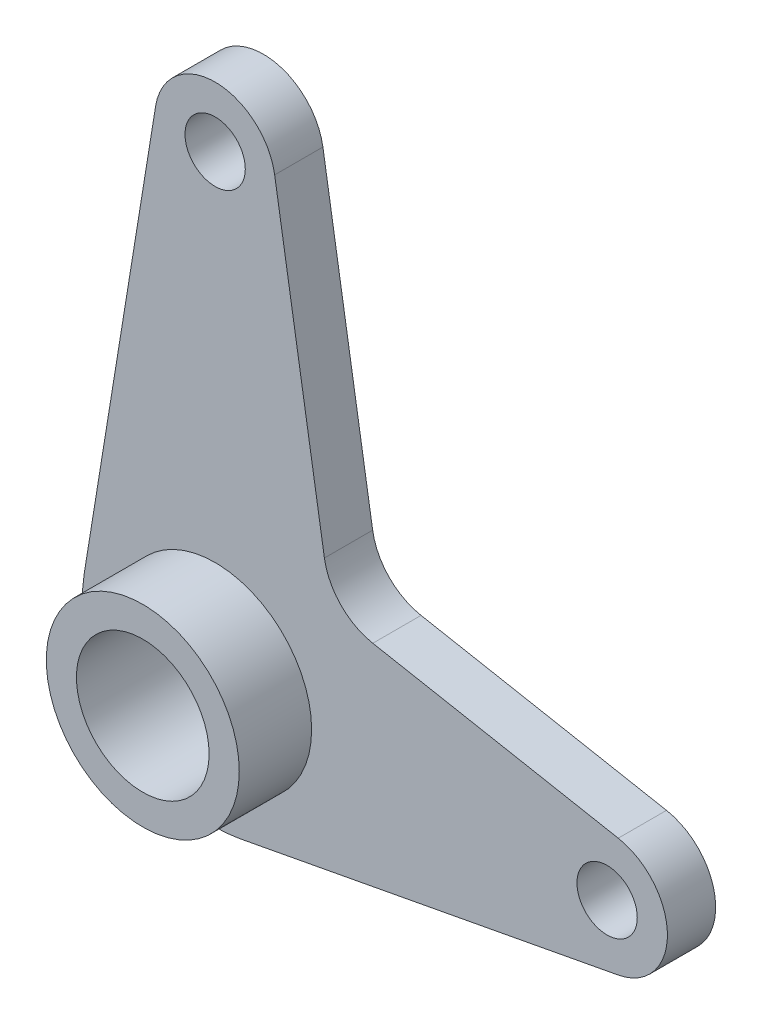
ISO-10303-21;
HEADER;
FILE_DESCRIPTION(('STEP AP214'),'2;1');
FILE_NAME('part.step','',(''),(''),'','','');
FILE_SCHEMA(('AUTOMOTIVE_DESIGN { 1 0 10303 214 1 1 1 1 }'));
ENDSEC;
DATA;
#1=APPLICATION_CONTEXT('core data for automotive mechanical design processes');
#2=APPLICATION_PROTOCOL_DEFINITION('international standard','automotive_design',2000,#1);
#3=PRODUCT_CONTEXT('',#1,'mechanical');
#4=PRODUCT('Part','Part','',(#3));
#5=PRODUCT_RELATED_PRODUCT_CATEGORY('part','',(#4));
#6=PRODUCT_DEFINITION_FORMATION('','',#4);
#7=PRODUCT_DEFINITION_CONTEXT('part definition',#1,'design');
#8=PRODUCT_DEFINITION('design','',#6,#7);
#9=PRODUCT_DEFINITION_SHAPE('','',#8);
#10=(LENGTH_UNIT() NAMED_UNIT(*) SI_UNIT(.MILLI.,.METRE.));
#11=(NAMED_UNIT(*) PLANE_ANGLE_UNIT() SI_UNIT($,.RADIAN.));
#12=(NAMED_UNIT(*) SI_UNIT($,.STERADIAN.) SOLID_ANGLE_UNIT());
#13=UNCERTAINTY_MEASURE_WITH_UNIT(LENGTH_MEASURE(1.E-05),#10,'distance_accuracy_value','');
#14=(GEOMETRIC_REPRESENTATION_CONTEXT(3) GLOBAL_UNCERTAINTY_ASSIGNED_CONTEXT((#13)) GLOBAL_UNIT_ASSIGNED_CONTEXT((#10,
#11,#12)) REPRESENTATION_CONTEXT('',''));
#15=CARTESIAN_POINT('',(0.,0.,0.));
#16=DIRECTION('',(0.,0.,1.));
#17=DIRECTION('',(1.,0.,0.));
#18=AXIS2_PLACEMENT_3D('',#15,#16,#17);
#19=CARTESIAN_POINT('',(27.9922328266238,27.3024419216633,8.));
#20=DIRECTION('',(0.,0.,1.));
#21=DIRECTION('',(1.,0.,0.));
#22=AXIS2_PLACEMENT_3D('',#19,#20,#21);
#23=PLANE('',#22);
#24=CARTESIAN_POINT('',(0.,0.,8.));
#25=DIRECTION('',(0.,0.,1.));
#26=DIRECTION('',(1.,0.,0.));
#27=AXIS2_PLACEMENT_3D('',#24,#25,#26);
#28=CIRCLE('',#27,16.);
#29=CARTESIAN_POINT('',(16.,0.,8.));
#30=VERTEX_POINT('',#29);
#31=EDGE_CURVE('E194',#30,#30,#28,.T.);
#32=ORIENTED_EDGE('',*,*,#31,.F.);
#33=EDGE_LOOP('',(#32));
#34=FACE_BOUND('',#33,.T.);
#35=CARTESIAN_POINT('',(0.,75.,8.));
#36=DIRECTION('',(0.,0.,1.));
#37=DIRECTION('',(1.,0.,0.));
#38=AXIS2_PLACEMENT_3D('',#35,#36,#37);
#39=CIRCLE('',#38,5.);
#40=CARTESIAN_POINT('',(5.,75.,8.));
#41=VERTEX_POINT('',#40);
#42=EDGE_CURVE('E137',#41,#41,#39,.T.);
#43=ORIENTED_EDGE('',*,*,#42,.F.);
#44=EDGE_LOOP('',(#43));
#45=FACE_BOUND('',#44,.T.);
#46=CARTESIAN_POINT('',(27.9922328266238,27.3024419216633,8.));
#47=DIRECTION('',(0.,0.,-1.));
#48=DIRECTION('',(1.,0.,0.));
#49=AXIS2_PLACEMENT_3D('',#46,#47,#48);
#50=CIRCLE('',#49,9.99999999999999);
#51=CARTESIAN_POINT('',(26.1458575860615,17.4743750481099,8.));
#52=VERTEX_POINT('',#51);
#53=CARTESIAN_POINT('',(18.1210626832213,25.7024419216633,8.));
#54=VERTEX_POINT('',#53);
#55=EDGE_CURVE('E148',#52,#54,#50,.T.);
#56=ORIENTED_EDGE('',*,*,#55,.T.);
#57=DIRECTION('',(-0.16,0.987117014340245,0.));
#58=VECTOR('',#57,1.);
#59=CARTESIAN_POINT('',(9.87117014340245,76.6,8.));
#60=LINE('',#59,#58);
#61=CARTESIAN_POINT('',(9.87117014340246,76.6,8.));
#62=VERTEX_POINT('',#61);
#63=EDGE_CURVE('E96',#54,#62,#60,.T.);
#64=ORIENTED_EDGE('',*,*,#63,.T.);
#65=CARTESIAN_POINT('',(0.,75.,8.));
#66=DIRECTION('',(0.,0.,1.));
#67=DIRECTION('',(1.,0.,0.));
#68=AXIS2_PLACEMENT_3D('',#65,#66,#67);
#69=CIRCLE('',#68,10.);
#70=CARTESIAN_POINT('',(-9.87117014340245,76.6,8.));
#71=VERTEX_POINT('',#70);
#72=EDGE_CURVE('E163',#62,#71,#69,.T.);
#73=ORIENTED_EDGE('',*,*,#72,.T.);
#74=DIRECTION('',(-0.16,-0.987117014340245,0.));
#75=VECTOR('',#74,1.);
#76=CARTESIAN_POINT('',(-9.87117014340245,76.6,8.));
#77=LINE('',#76,#75);
#78=CARTESIAN_POINT('',(-21.7165743154854,3.52,8.));
#79=VERTEX_POINT('',#78);
#80=EDGE_CURVE('E176',#71,#79,#77,.T.);
#81=ORIENTED_EDGE('',*,*,#80,.T.);
#82=CARTESIAN_POINT('',(0.,0.,8.));
#83=DIRECTION('',(0.,0.,1.));
#84=DIRECTION('',(1.,0.,0.));
#85=AXIS2_PLACEMENT_3D('',#82,#83,#84);
#86=CIRCLE('',#85,22.);
#87=CARTESIAN_POINT('',(4.06153846153843,-21.6218386203728,8.));
#88=VERTEX_POINT('',#87);
#89=EDGE_CURVE('E115',#79,#88,#86,.T.);
#90=ORIENTED_EDGE('',*,*,#89,.T.);
#91=DIRECTION('',(0.982810846380581,0.184615384615383,0.));
#92=VECTOR('',#91,1.);
#93=CARTESIAN_POINT('',(4.06153846153843,-21.6218386203728,8.));
#94=LINE('',#93,#92);
#95=CARTESIAN_POINT('',(66.8461538461539,-9.82810846380591,8.));
#96=VERTEX_POINT('',#95);
#97=EDGE_CURVE('E109',#88,#96,#94,.T.);
#98=ORIENTED_EDGE('',*,*,#97,.T.);
#99=CARTESIAN_POINT('',(64.9999999999999,0.,8.));
#100=DIRECTION('',(0.,0.,1.));
#101=DIRECTION('',(1.,0.,0.));
#102=AXIS2_PLACEMENT_3D('',#99,#100,#101);
#103=CIRCLE('',#102,10.0000000000001);
#104=CARTESIAN_POINT('',(66.8463752405623,9.82806687355354,8.));
#105=VERTEX_POINT('',#104);
#106=EDGE_CURVE('E113',#96,#105,#103,.T.);
#107=ORIENTED_EDGE('',*,*,#106,.T.);
#108=DIRECTION('',(-0.982806687355345,0.184637524056227,0.));
#109=VECTOR('',#108,1.);
#110=CARTESIAN_POINT('',(26.1458575860615,17.4743750481099,8.));
#111=LINE('',#110,#109);
#112=EDGE_CURVE('E53',#105,#52,#111,.T.);
#113=ORIENTED_EDGE('',*,*,#112,.T.);
#114=EDGE_LOOP('',(#56,#64,#73,#81,#90,#98,#107,#113));
#115=FACE_BOUND('',#114,.T.);
#116=CARTESIAN_POINT('',(64.9999999999999,0.,8.));
#117=DIRECTION('',(0.,0.,1.));
#118=DIRECTION('',(1.,0.,0.));
#119=AXIS2_PLACEMENT_3D('',#116,#117,#118);
#120=CIRCLE('',#119,4.99999999999983);
#121=CARTESIAN_POINT('',(69.9999999999998,0.,8.));
#122=VERTEX_POINT('',#121);
#123=EDGE_CURVE('E185',#122,#122,#120,.T.);
#124=ORIENTED_EDGE('',*,*,#123,.F.);
#125=EDGE_LOOP('',(#124));
#126=FACE_BOUND('',#125,.T.);
#127=ADVANCED_FACE('F36',(#34,#45,#115,#126),#23,.T.);
#128=CARTESIAN_POINT('',(27.9922328266238,27.3024419216633,0.));
#129=DIRECTION('',(0.,0.,1.));
#130=DIRECTION('',(1.,0.,0.));
#131=AXIS2_PLACEMENT_3D('',#128,#129,#130);
#132=PLANE('',#131);
#133=CARTESIAN_POINT('',(0.,0.,0.));
#134=DIRECTION('',(0.,0.,1.));
#135=DIRECTION('',(1.,0.,0.));
#136=AXIS2_PLACEMENT_3D('',#133,#134,#135);
#137=CIRCLE('',#136,11.);
#138=CARTESIAN_POINT('',(11.,0.,0.));
#139=VERTEX_POINT('',#138);
#140=EDGE_CURVE('E197',#139,#139,#137,.T.);
#141=ORIENTED_EDGE('',*,*,#140,.T.);
#142=EDGE_LOOP('',(#141));
#143=FACE_BOUND('',#142,.T.);
#144=CARTESIAN_POINT('',(27.9922328266238,27.3024419216633,0.));
#145=DIRECTION('',(0.,0.,-1.));
#146=DIRECTION('',(1.,0.,0.));
#147=AXIS2_PLACEMENT_3D('',#144,#145,#146);
#148=CIRCLE('',#147,9.99999999999999);
#149=CARTESIAN_POINT('',(26.1458575860615,17.4743750481099,0.));
#150=VERTEX_POINT('',#149);
#151=CARTESIAN_POINT('',(18.1210626832213,25.7024419216633,0.));
#152=VERTEX_POINT('',#151);
#153=EDGE_CURVE('E133',#150,#152,#148,.T.);
#154=ORIENTED_EDGE('',*,*,#153,.F.);
#155=DIRECTION('',(-0.982806687355345,0.184637524056227,0.));
#156=VECTOR('',#155,1.);
#157=CARTESIAN_POINT('',(26.1458575860615,17.4743750481099,0.));
#158=LINE('',#157,#156);
#159=CARTESIAN_POINT('',(66.8463752405623,9.82806687355354,0.));
#160=VERTEX_POINT('',#159);
#161=EDGE_CURVE('E88',#160,#150,#158,.T.);
#162=ORIENTED_EDGE('',*,*,#161,.F.);
#163=CARTESIAN_POINT('',(64.9999999999999,0.,0.));
#164=DIRECTION('',(0.,0.,1.));
#165=DIRECTION('',(1.,0.,0.));
#166=AXIS2_PLACEMENT_3D('',#163,#164,#165);
#167=CIRCLE('',#166,10.0000000000001);
#168=CARTESIAN_POINT('',(66.8461538461539,-9.82810846380591,0.));
#169=VERTEX_POINT('',#168);
#170=EDGE_CURVE('E82',#169,#160,#167,.T.);
#171=ORIENTED_EDGE('',*,*,#170,.F.);
#172=DIRECTION('',(0.982810846380581,0.184615384615383,0.));
#173=VECTOR('',#172,1.);
#174=CARTESIAN_POINT('',(4.06153846153843,-21.6218386203728,0.));
#175=LINE('',#174,#173);
#176=CARTESIAN_POINT('',(4.06153846153843,-21.6218386203728,0.));
#177=VERTEX_POINT('',#176);
#178=EDGE_CURVE('E123',#177,#169,#175,.T.);
#179=ORIENTED_EDGE('',*,*,#178,.F.);
#180=CARTESIAN_POINT('',(0.,0.,0.));
#181=DIRECTION('',(0.,0.,1.));
#182=DIRECTION('',(1.,0.,0.));
#183=AXIS2_PLACEMENT_3D('',#180,#181,#182);
#184=CIRCLE('',#183,22.);
#185=CARTESIAN_POINT('',(-21.7165743154854,3.52,0.));
#186=VERTEX_POINT('',#185);
#187=EDGE_CURVE('E143',#186,#177,#184,.T.);
#188=ORIENTED_EDGE('',*,*,#187,.F.);
#189=DIRECTION('',(-0.16,-0.987117014340245,0.));
#190=VECTOR('',#189,1.);
#191=CARTESIAN_POINT('',(-9.87117014340245,76.6,0.));
#192=LINE('',#191,#190);
#193=CARTESIAN_POINT('',(-9.87117014340245,76.6,0.));
#194=VERTEX_POINT('',#193);
#195=EDGE_CURVE('E141',#194,#186,#192,.T.);
#196=ORIENTED_EDGE('',*,*,#195,.F.);
#197=CARTESIAN_POINT('',(0.,75.,0.));
#198=DIRECTION('',(0.,0.,1.));
#199=DIRECTION('',(1.,0.,0.));
#200=AXIS2_PLACEMENT_3D('',#197,#198,#199);
#201=CIRCLE('',#200,10.);
#202=CARTESIAN_POINT('',(9.87117014340246,76.6,0.));
#203=VERTEX_POINT('',#202);
#204=EDGE_CURVE('E139',#203,#194,#201,.T.);
#205=ORIENTED_EDGE('',*,*,#204,.F.);
#206=DIRECTION('',(-0.16,0.987117014340245,0.));
#207=VECTOR('',#206,1.);
#208=CARTESIAN_POINT('',(9.87117014340245,76.6,0.));
#209=LINE('',#208,#207);
#210=EDGE_CURVE('E136',#152,#203,#209,.T.);
#211=ORIENTED_EDGE('',*,*,#210,.F.);
#212=EDGE_LOOP('',(#154,#162,#171,#179,#188,#196,#205,#211));
#213=FACE_BOUND('',#212,.T.);
#214=CARTESIAN_POINT('',(0.,75.,0.));
#215=DIRECTION('',(0.,0.,1.));
#216=DIRECTION('',(1.,0.,0.));
#217=AXIS2_PLACEMENT_3D('',#214,#215,#216);
#218=CIRCLE('',#217,5.);
#219=CARTESIAN_POINT('',(5.,75.,0.));
#220=VERTEX_POINT('',#219);
#221=EDGE_CURVE('E182',#220,#220,#218,.T.);
#222=ORIENTED_EDGE('',*,*,#221,.T.);
#223=EDGE_LOOP('',(#222));
#224=FACE_BOUND('',#223,.T.);
#225=CARTESIAN_POINT('',(64.9999999999999,0.,0.));
#226=DIRECTION('',(0.,0.,1.));
#227=DIRECTION('',(1.,0.,0.));
#228=AXIS2_PLACEMENT_3D('',#225,#226,#227);
#229=CIRCLE('',#228,4.99999999999983);
#230=CARTESIAN_POINT('',(69.9999999999998,0.,0.));
#231=VERTEX_POINT('',#230);
#232=EDGE_CURVE('E188',#231,#231,#229,.T.);
#233=ORIENTED_EDGE('',*,*,#232,.T.);
#234=EDGE_LOOP('',(#233));
#235=FACE_BOUND('',#234,.T.);
#236=ADVANCED_FACE('F167',(#143,#213,#224,#235),#132,.F.);
#237=CARTESIAN_POINT('',(27.9922328266238,27.3024419216633,8.));
#238=DIRECTION('',(0.,0.,-1.));
#239=DIRECTION('',(-1.,0.,0.));
#240=AXIS2_PLACEMENT_3D('',#237,#238,#239);
#241=CYLINDRICAL_SURFACE('',#240,9.99999999999999);
#242=ORIENTED_EDGE('',*,*,#153,.T.);
#243=DIRECTION('',(0.,0.,-1.));
#244=VECTOR('',#243,1.);
#245=CARTESIAN_POINT('',(18.1210626832213,25.7024419216633,8.));
#246=LINE('',#245,#244);
#247=EDGE_CURVE('E11',#54,#152,#246,.T.);
#248=ORIENTED_EDGE('',*,*,#247,.F.);
#249=ORIENTED_EDGE('',*,*,#55,.F.);
#250=DIRECTION('',(0.,0.,-1.));
#251=VECTOR('',#250,1.);
#252=CARTESIAN_POINT('',(26.1458575860615,17.4743750481099,8.));
#253=LINE('',#252,#251);
#254=EDGE_CURVE('E129',#52,#150,#253,.T.);
#255=ORIENTED_EDGE('',*,*,#254,.T.);
#256=EDGE_LOOP('',(#242,#248,#249,#255));
#257=FACE_BOUND('',#256,.T.);
#258=ADVANCED_FACE('F38',(#257),#241,.F.);
#259=CARTESIAN_POINT('',(9.87117014340245,76.6,8.));
#260=DIRECTION('',(-0.987117014340245,-0.16,0.));
#261=DIRECTION('',(0.16,-0.987117014340245,0.));
#262=AXIS2_PLACEMENT_3D('',#259,#260,#261);
#263=PLANE('',#262);
#264=ORIENTED_EDGE('',*,*,#210,.T.);
#265=DIRECTION('',(0.,0.,-1.));
#266=VECTOR('',#265,1.);
#267=CARTESIAN_POINT('',(9.87117014340246,76.6,8.));
#268=LINE('',#267,#266);
#269=EDGE_CURVE('E45',#62,#203,#268,.T.);
#270=ORIENTED_EDGE('',*,*,#269,.F.);
#271=ORIENTED_EDGE('',*,*,#63,.F.);
#272=ORIENTED_EDGE('',*,*,#247,.T.);
#273=EDGE_LOOP('',(#264,#270,#271,#272));
#274=FACE_BOUND('',#273,.T.);
#275=ADVANCED_FACE('F259',(#274),#263,.F.);
#276=CARTESIAN_POINT('',(0.,75.,8.));
#277=DIRECTION('',(0.,0.,-1.));
#278=DIRECTION('',(-1.,0.,0.));
#279=AXIS2_PLACEMENT_3D('',#276,#277,#278);
#280=CYLINDRICAL_SURFACE('',#279,10.);
#281=ORIENTED_EDGE('',*,*,#204,.T.);
#282=DIRECTION('',(0.,0.,-1.));
#283=VECTOR('',#282,1.);
#284=CARTESIAN_POINT('',(-9.87117014340245,76.6,8.));
#285=LINE('',#284,#283);
#286=EDGE_CURVE('E155',#71,#194,#285,.T.);
#287=ORIENTED_EDGE('',*,*,#286,.F.);
#288=ORIENTED_EDGE('',*,*,#72,.F.);
#289=ORIENTED_EDGE('',*,*,#269,.T.);
#290=EDGE_LOOP('',(#281,#287,#288,#289));
#291=FACE_BOUND('',#290,.T.);
#292=ADVANCED_FACE('F161',(#291),#280,.T.);
#293=CARTESIAN_POINT('',(-9.87117014340245,76.6,8.));
#294=DIRECTION('',(0.987117014340245,-0.16,0.));
#295=DIRECTION('',(0.16,0.987117014340245,0.));
#296=AXIS2_PLACEMENT_3D('',#293,#294,#295);
#297=PLANE('',#296);
#298=ORIENTED_EDGE('',*,*,#195,.T.);
#299=DIRECTION('',(0.,0.,-1.));
#300=VECTOR('',#299,1.);
#301=CARTESIAN_POINT('',(-21.7165743154854,3.52,8.));
#302=LINE('',#301,#300);
#303=EDGE_CURVE('E152',#79,#186,#302,.T.);
#304=ORIENTED_EDGE('',*,*,#303,.F.);
#305=ORIENTED_EDGE('',*,*,#80,.F.);
#306=ORIENTED_EDGE('',*,*,#286,.T.);
#307=EDGE_LOOP('',(#298,#304,#305,#306));
#308=FACE_BOUND('',#307,.T.);
#309=ADVANCED_FACE('F172',(#308),#297,.F.);
#310=CARTESIAN_POINT('',(0.,0.,8.));
#311=DIRECTION('',(0.,0.,-1.));
#312=DIRECTION('',(-1.,0.,0.));
#313=AXIS2_PLACEMENT_3D('',#310,#311,#312);
#314=CYLINDRICAL_SURFACE('',#313,22.);
#315=ORIENTED_EDGE('',*,*,#187,.T.);
#316=DIRECTION('',(0.,0.,-1.));
#317=VECTOR('',#316,1.);
#318=CARTESIAN_POINT('',(4.06153846153843,-21.6218386203728,8.));
#319=LINE('',#318,#317);
#320=EDGE_CURVE('E124',#88,#177,#319,.T.);
#321=ORIENTED_EDGE('',*,*,#320,.F.);
#322=ORIENTED_EDGE('',*,*,#89,.F.);
#323=ORIENTED_EDGE('',*,*,#303,.T.);
#324=EDGE_LOOP('',(#315,#321,#322,#323));
#325=FACE_BOUND('',#324,.T.);
#326=ADVANCED_FACE('F175',(#325),#314,.T.);
#327=CARTESIAN_POINT('',(4.06153846153843,-21.6218386203728,8.));
#328=DIRECTION('',(-0.184615384615383,0.982810846380581,0.));
#329=DIRECTION('',(-0.982810846380581,-0.184615384615383,0.));
#330=AXIS2_PLACEMENT_3D('',#327,#328,#329);
#331=PLANE('',#330);
#332=ORIENTED_EDGE('',*,*,#178,.T.);
#333=DIRECTION('',(0.,0.,-1.));
#334=VECTOR('',#333,1.);
#335=CARTESIAN_POINT('',(66.8461538461539,-9.82810846380591,8.));
#336=LINE('',#335,#334);
#337=EDGE_CURVE('E120',#96,#169,#336,.T.);
#338=ORIENTED_EDGE('',*,*,#337,.F.);
#339=ORIENTED_EDGE('',*,*,#97,.F.);
#340=ORIENTED_EDGE('',*,*,#320,.T.);
#341=EDGE_LOOP('',(#332,#338,#339,#340));
#342=FACE_BOUND('',#341,.T.);
#343=ADVANCED_FACE('F121',(#342),#331,.F.);
#344=CARTESIAN_POINT('',(64.9999999999999,0.,8.));
#345=DIRECTION('',(0.,0.,-1.));
#346=DIRECTION('',(-1.,0.,0.));
#347=AXIS2_PLACEMENT_3D('',#344,#345,#346);
#348=CYLINDRICAL_SURFACE('',#347,10.0000000000001);
#349=ORIENTED_EDGE('',*,*,#170,.T.);
#350=DIRECTION('',(0.,0.,-1.));
#351=VECTOR('',#350,1.);
#352=CARTESIAN_POINT('',(66.8463752405623,9.82806687355354,8.));
#353=LINE('',#352,#351);
#354=EDGE_CURVE('E125',#105,#160,#353,.T.);
#355=ORIENTED_EDGE('',*,*,#354,.F.);
#356=ORIENTED_EDGE('',*,*,#106,.F.);
#357=ORIENTED_EDGE('',*,*,#337,.T.);
#358=EDGE_LOOP('',(#349,#355,#356,#357));
#359=FACE_BOUND('',#358,.T.);
#360=ADVANCED_FACE('F127',(#359),#348,.T.);
#361=CARTESIAN_POINT('',(26.1458575860615,17.4743750481099,8.));
#362=DIRECTION('',(-0.184637524056227,-0.982806687355345,0.));
#363=DIRECTION('',(0.982806687355345,-0.184637524056227,0.));
#364=AXIS2_PLACEMENT_3D('',#361,#362,#363);
#365=PLANE('',#364);
#366=ORIENTED_EDGE('',*,*,#161,.T.);
#367=ORIENTED_EDGE('',*,*,#254,.F.);
#368=ORIENTED_EDGE('',*,*,#112,.F.);
#369=ORIENTED_EDGE('',*,*,#354,.T.);
#370=EDGE_LOOP('',(#366,#367,#368,#369));
#371=FACE_BOUND('',#370,.T.);
#372=ADVANCED_FACE('F234',(#371),#365,.F.);
#373=CARTESIAN_POINT('',(0.,75.,8.));
#374=DIRECTION('',(0.,0.,-1.));
#375=DIRECTION('',(-1.,0.,0.));
#376=AXIS2_PLACEMENT_3D('',#373,#374,#375);
#377=CYLINDRICAL_SURFACE('',#376,5.);
#378=ORIENTED_EDGE('',*,*,#42,.T.);
#379=EDGE_LOOP('',(#378));
#380=FACE_BOUND('',#379,.T.);
#381=ORIENTED_EDGE('',*,*,#221,.F.);
#382=EDGE_LOOP('',(#381));
#383=FACE_BOUND('',#382,.T.);
#384=ADVANCED_FACE('F231',(#380,#383),#377,.F.);
#385=CARTESIAN_POINT('',(64.9999999999999,0.,8.));
#386=DIRECTION('',(0.,0.,-1.));
#387=DIRECTION('',(-1.,0.,0.));
#388=AXIS2_PLACEMENT_3D('',#385,#386,#387);
#389=CYLINDRICAL_SURFACE('',#388,4.99999999999983);
#390=ORIENTED_EDGE('',*,*,#123,.T.);
#391=EDGE_LOOP('',(#390));
#392=FACE_BOUND('',#391,.T.);
#393=ORIENTED_EDGE('',*,*,#232,.F.);
#394=EDGE_LOOP('',(#393));
#395=FACE_BOUND('',#394,.T.);
#396=ADVANCED_FACE('F222',(#392,#395),#389,.F.);
#397=CARTESIAN_POINT('',(0.,0.,20.));
#398=DIRECTION('',(0.,0.,-1.));
#399=DIRECTION('',(-1.,0.,0.));
#400=AXIS2_PLACEMENT_3D('',#397,#398,#399);
#401=CYLINDRICAL_SURFACE('',#400,16.);
#402=CARTESIAN_POINT('',(0.,0.,20.));
#403=DIRECTION('',(0.,0.,1.));
#404=DIRECTION('',(1.,0.,0.));
#405=AXIS2_PLACEMENT_3D('',#402,#403,#404);
#406=CIRCLE('',#405,16.);
#407=CARTESIAN_POINT('',(16.,0.,20.));
#408=VERTEX_POINT('',#407);
#409=EDGE_CURVE('E191',#408,#408,#406,.T.);
#410=ORIENTED_EDGE('',*,*,#409,.F.);
#411=EDGE_LOOP('',(#410));
#412=FACE_BOUND('',#411,.T.);
#413=ORIENTED_EDGE('',*,*,#31,.T.);
#414=EDGE_LOOP('',(#413));
#415=FACE_BOUND('',#414,.T.);
#416=ADVANCED_FACE('F216',(#412,#415),#401,.T.);
#417=CARTESIAN_POINT('',(0.,0.,20.));
#418=DIRECTION('',(0.,0.,1.));
#419=DIRECTION('',(1.,0.,0.));
#420=AXIS2_PLACEMENT_3D('',#417,#418,#419);
#421=PLANE('',#420);
#422=CARTESIAN_POINT('',(0.,0.,20.));
#423=DIRECTION('',(0.,0.,1.));
#424=DIRECTION('',(1.,0.,0.));
#425=AXIS2_PLACEMENT_3D('',#422,#423,#424);
#426=CIRCLE('',#425,11.);
#427=CARTESIAN_POINT('',(11.,0.,20.));
#428=VERTEX_POINT('',#427);
#429=EDGE_CURVE('E200',#428,#428,#426,.T.);
#430=ORIENTED_EDGE('',*,*,#429,.F.);
#431=EDGE_LOOP('',(#430));
#432=FACE_BOUND('',#431,.T.);
#433=ORIENTED_EDGE('',*,*,#409,.T.);
#434=EDGE_LOOP('',(#433));
#435=FACE_BOUND('',#434,.T.);
#436=ADVANCED_FACE('F210',(#432,#435),#421,.T.);
#437=CARTESIAN_POINT('',(0.,0.,0.));
#438=DIRECTION('',(0.,0.,1.));
#439=DIRECTION('',(1.,0.,0.));
#440=AXIS2_PLACEMENT_3D('',#437,#438,#439);
#441=CYLINDRICAL_SURFACE('',#440,11.);
#442=ORIENTED_EDGE('',*,*,#140,.F.);
#443=EDGE_LOOP('',(#442));
#444=FACE_BOUND('',#443,.T.);
#445=ORIENTED_EDGE('',*,*,#429,.T.);
#446=EDGE_LOOP('',(#445));
#447=FACE_BOUND('',#446,.T.);
#448=ADVANCED_FACE('F207',(#444,#447),#441,.F.);
#449=CLOSED_SHELL('',(#127,#236,#258,#275,#292,#309,#326,#343,#360,#372,#384,#396,#416,#436,#448));
#450=MANIFOLD_SOLID_BREP('B2',#449);
#451=ADVANCED_BREP_SHAPE_REPRESENTATION('',(#18,#450),#14);
#452=SHAPE_DEFINITION_REPRESENTATION(#9,#451);
ENDSEC;
END-ISO-10303-21;
